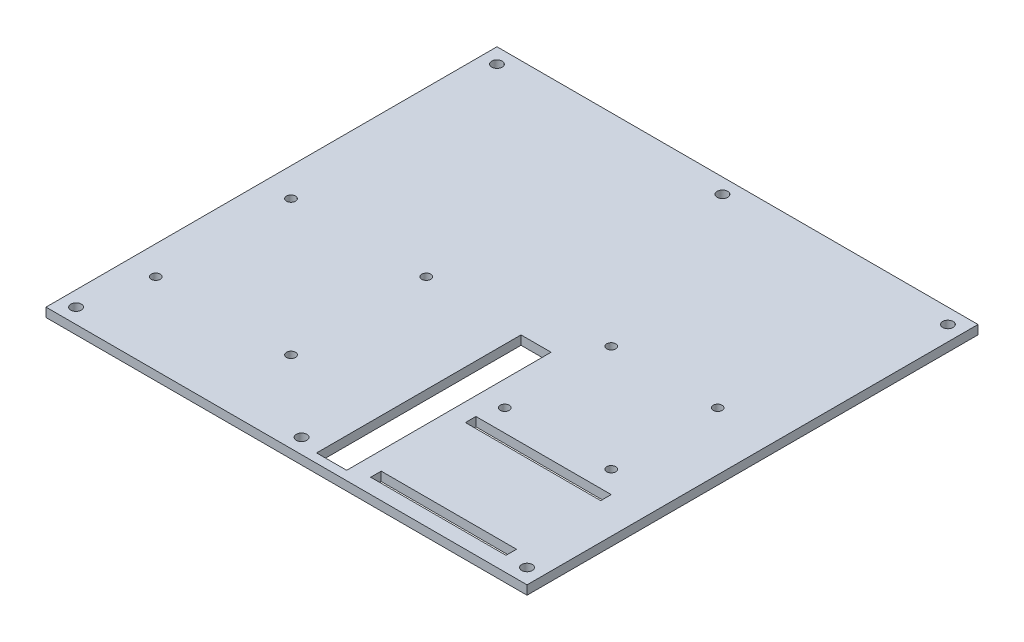
ISO-10303-21;
HEADER;
FILE_DESCRIPTION(('STEP AP214'),'2;1');
FILE_NAME('part.step','',(''),(''),'','','');
FILE_SCHEMA(('AUTOMOTIVE_DESIGN { 1 0 10303 214 1 1 1 1 }'));
ENDSEC;
DATA;
#1=APPLICATION_CONTEXT('core data for automotive mechanical design processes');
#2=APPLICATION_PROTOCOL_DEFINITION('international standard','automotive_design',2000,#1);
#3=PRODUCT_CONTEXT('',#1,'mechanical');
#4=PRODUCT('Part','Part','',(#3));
#5=PRODUCT_RELATED_PRODUCT_CATEGORY('part','',(#4));
#6=PRODUCT_DEFINITION_FORMATION('','',#4);
#7=PRODUCT_DEFINITION_CONTEXT('part definition',#1,'design');
#8=PRODUCT_DEFINITION('design','',#6,#7);
#9=PRODUCT_DEFINITION_SHAPE('','',#8);
#10=(LENGTH_UNIT() NAMED_UNIT(*) SI_UNIT(.MILLI.,.METRE.));
#11=(NAMED_UNIT(*) PLANE_ANGLE_UNIT() SI_UNIT($,.RADIAN.));
#12=(NAMED_UNIT(*) SI_UNIT($,.STERADIAN.) SOLID_ANGLE_UNIT());
#13=UNCERTAINTY_MEASURE_WITH_UNIT(LENGTH_MEASURE(1.E-05),#10,'distance_accuracy_value','');
#14=(GEOMETRIC_REPRESENTATION_CONTEXT(3) GLOBAL_UNCERTAINTY_ASSIGNED_CONTEXT((#13)) GLOBAL_UNIT_ASSIGNED_CONTEXT((#10,
#11,#12)) REPRESENTATION_CONTEXT('',''));
#15=CARTESIAN_POINT('',(0.,0.,0.));
#16=DIRECTION('',(0.,0.,1.));
#17=DIRECTION('',(1.,0.,0.));
#18=AXIS2_PLACEMENT_3D('',#15,#16,#17);
#19=CARTESIAN_POINT('',(0.,3.,0.));
#20=DIRECTION('',(0.,1.,0.));
#21=DIRECTION('',(0.,0.,1.));
#22=AXIS2_PLACEMENT_3D('',#19,#20,#21);
#23=PLANE('',#22);
#24=CARTESIAN_POINT('',(75.,3.,-70.));
#25=DIRECTION('',(0.,1.,0.));
#26=DIRECTION('',(0.,0.,1.));
#27=AXIS2_PLACEMENT_3D('',#24,#25,#26);
#28=CIRCLE('',#27,1.75);
#29=CARTESIAN_POINT('',(75.,3.,-68.25));
#30=VERTEX_POINT('',#29);
#31=EDGE_CURVE('E444',#30,#30,#28,.T.);
#32=ORIENTED_EDGE('',*,*,#31,.F.);
#33=EDGE_LOOP('',(#32));
#34=FACE_BOUND('',#33,.T.);
#35=CARTESIAN_POINT('',(0.,3.,-70.));
#36=DIRECTION('',(0.,1.,0.));
#37=DIRECTION('',(0.,0.,1.));
#38=AXIS2_PLACEMENT_3D('',#35,#36,#37);
#39=CIRCLE('',#38,1.75);
#40=CARTESIAN_POINT('',(0.,3.,-68.25));
#41=VERTEX_POINT('',#40);
#42=EDGE_CURVE('E450',#41,#41,#39,.T.);
#43=ORIENTED_EDGE('',*,*,#42,.F.);
#44=EDGE_LOOP('',(#43));
#45=FACE_BOUND('',#44,.T.);
#46=CARTESIAN_POINT('',(-75.,3.,70.));
#47=DIRECTION('',(0.,1.,0.));
#48=DIRECTION('',(0.,0.,1.));
#49=AXIS2_PLACEMENT_3D('',#46,#47,#48);
#50=CIRCLE('',#49,1.75);
#51=CARTESIAN_POINT('',(-75.,3.,71.75));
#52=VERTEX_POINT('',#51);
#53=EDGE_CURVE('E456',#52,#52,#50,.T.);
#54=ORIENTED_EDGE('',*,*,#53,.F.);
#55=EDGE_LOOP('',(#54));
#56=FACE_BOUND('',#55,.T.);
#57=CARTESIAN_POINT('',(0.,3.,70.));
#58=DIRECTION('',(0.,1.,0.));
#59=DIRECTION('',(0.,0.,1.));
#60=AXIS2_PLACEMENT_3D('',#57,#58,#59);
#61=CIRCLE('',#60,1.75);
#62=CARTESIAN_POINT('',(0.,3.,71.75));
#63=VERTEX_POINT('',#62);
#64=EDGE_CURVE('E437',#63,#63,#61,.T.);
#65=ORIENTED_EDGE('',*,*,#64,.F.);
#66=EDGE_LOOP('',(#65));
#67=FACE_BOUND('',#66,.T.);
#68=CARTESIAN_POINT('',(75.,3.,70.));
#69=DIRECTION('',(0.,1.,0.));
#70=DIRECTION('',(0.,0.,1.));
#71=AXIS2_PLACEMENT_3D('',#68,#69,#70);
#72=CIRCLE('',#71,1.75);
#73=CARTESIAN_POINT('',(75.,3.,71.75));
#74=VERTEX_POINT('',#73);
#75=EDGE_CURVE('E434',#74,#74,#72,.T.);
#76=ORIENTED_EDGE('',*,*,#75,.F.);
#77=EDGE_LOOP('',(#76));
#78=FACE_BOUND('',#77,.T.);
#79=CARTESIAN_POINT('',(-75.,3.,-70.));
#80=DIRECTION('',(0.,1.,0.));
#81=DIRECTION('',(0.,0.,1.));
#82=AXIS2_PLACEMENT_3D('',#79,#80,#81);
#83=CIRCLE('',#82,1.75);
#84=CARTESIAN_POINT('',(-75.,3.,-68.25));
#85=VERTEX_POINT('',#84);
#86=EDGE_CURVE('E443',#85,#85,#83,.T.);
#87=ORIENTED_EDGE('',*,*,#86,.F.);
#88=EDGE_LOOP('',(#87));
#89=FACE_BOUND('',#88,.T.);
#90=CARTESIAN_POINT('',(60.7,3.,-7.70000000000003));
#91=DIRECTION('',(0.,1.,0.));
#92=DIRECTION('',(0.,0.,1.));
#93=AXIS2_PLACEMENT_3D('',#90,#91,#92);
#94=CIRCLE('',#93,1.5);
#95=CARTESIAN_POINT('',(60.7,3.,-6.20000000000002));
#96=VERTEX_POINT('',#95);
#97=EDGE_CURVE('E467',#96,#96,#94,.T.);
#98=ORIENTED_EDGE('',*,*,#97,.F.);
#99=EDGE_LOOP('',(#98));
#100=FACE_BOUND('',#99,.T.);
#101=CARTESIAN_POINT('',(25.3,3.,-7.70000000000003));
#102=DIRECTION('',(0.,1.,0.));
#103=DIRECTION('',(0.,0.,1.));
#104=AXIS2_PLACEMENT_3D('',#101,#102,#103);
#105=CIRCLE('',#104,1.5);
#106=CARTESIAN_POINT('',(25.3,3.,-6.20000000000003));
#107=VERTEX_POINT('',#106);
#108=EDGE_CURVE('E480',#107,#107,#105,.T.);
#109=ORIENTED_EDGE('',*,*,#108,.F.);
#110=EDGE_LOOP('',(#109));
#111=FACE_BOUND('',#110,.T.);
#112=CARTESIAN_POINT('',(25.3,3.,27.7));
#113=DIRECTION('',(0.,1.,0.));
#114=DIRECTION('',(0.,0.,1.));
#115=AXIS2_PLACEMENT_3D('',#112,#113,#114);
#116=CIRCLE('',#115,1.5);
#117=CARTESIAN_POINT('',(25.3,3.,29.2));
#118=VERTEX_POINT('',#117);
#119=EDGE_CURVE('E474',#118,#118,#116,.T.);
#120=ORIENTED_EDGE('',*,*,#119,.F.);
#121=EDGE_LOOP('',(#120));
#122=FACE_BOUND('',#121,.T.);
#123=CARTESIAN_POINT('',(60.7,3.,27.7));
#124=DIRECTION('',(0.,1.,0.));
#125=DIRECTION('',(0.,0.,1.));
#126=AXIS2_PLACEMENT_3D('',#123,#124,#125);
#127=CIRCLE('',#126,1.5);
#128=CARTESIAN_POINT('',(60.7,3.,29.2));
#129=VERTEX_POINT('',#128);
#130=EDGE_CURVE('E473',#129,#129,#127,.T.);
#131=ORIENTED_EDGE('',*,*,#130,.F.);
#132=EDGE_LOOP('',(#131));
#133=FACE_BOUND('',#132,.T.);
#134=CARTESIAN_POINT('',(-25.5,3.,3.00000000000003));
#135=DIRECTION('',(0.,1.,0.));
#136=DIRECTION('',(0.,0.,-1.));
#137=AXIS2_PLACEMENT_3D('',#134,#135,#136);
#138=CIRCLE('',#137,1.5);
#139=CARTESIAN_POINT('',(-25.5,3.,1.50000000000002));
#140=VERTEX_POINT('',#139);
#141=EDGE_CURVE('E491',#140,#140,#138,.T.);
#142=ORIENTED_EDGE('',*,*,#141,.F.);
#143=EDGE_LOOP('',(#142));
#144=FACE_BOUND('',#143,.T.);
#145=CARTESIAN_POINT('',(-25.5,3.,48.));
#146=DIRECTION('',(0.,1.,0.));
#147=DIRECTION('',(0.,0.,-1.));
#148=AXIS2_PLACEMENT_3D('',#145,#146,#147);
#149=CIRCLE('',#148,1.5);
#150=CARTESIAN_POINT('',(-25.5,3.,46.5));
#151=VERTEX_POINT('',#150);
#152=EDGE_CURVE('E503',#151,#151,#149,.T.);
#153=ORIENTED_EDGE('',*,*,#152,.F.);
#154=EDGE_LOOP('',(#153));
#155=FACE_BOUND('',#154,.T.);
#156=CARTESIAN_POINT('',(-70.5,3.,48.));
#157=DIRECTION('',(0.,1.,0.));
#158=DIRECTION('',(0.,0.,1.));
#159=AXIS2_PLACEMENT_3D('',#156,#157,#158);
#160=CIRCLE('',#159,1.5);
#161=CARTESIAN_POINT('',(-70.5,3.,49.5));
#162=VERTEX_POINT('',#161);
#163=EDGE_CURVE('E497',#162,#162,#160,.T.);
#164=ORIENTED_EDGE('',*,*,#163,.F.);
#165=EDGE_LOOP('',(#164));
#166=FACE_BOUND('',#165,.T.);
#167=CARTESIAN_POINT('',(-70.5,3.,3.00000000000003));
#168=DIRECTION('',(0.,1.,0.));
#169=DIRECTION('',(0.,0.,1.));
#170=AXIS2_PLACEMENT_3D('',#167,#168,#169);
#171=CIRCLE('',#170,1.5);
#172=CARTESIAN_POINT('',(-70.5,3.,4.50000000000003));
#173=VERTEX_POINT('',#172);
#174=EDGE_CURVE('E167',#173,#173,#171,.T.);
#175=ORIENTED_EDGE('',*,*,#174,.F.);
#176=EDGE_LOOP('',(#175));
#177=FACE_BOUND('',#176,.T.);
#178=DIRECTION('',(0.,0.,1.));
#179=VECTOR('',#178,1.);
#180=CARTESIAN_POINT('',(23.,3.,70.));
#181=LINE('',#180,#179);
#182=CARTESIAN_POINT('',(23.,3.,66.5));
#183=VERTEX_POINT('',#182);
#184=CARTESIAN_POINT('',(23.,3.,70.));
#185=VERTEX_POINT('',#184);
#186=EDGE_CURVE('E180',#183,#185,#181,.T.);
#187=ORIENTED_EDGE('',*,*,#186,.F.);
#188=DIRECTION('',(-1.,0.,0.));
#189=VECTOR('',#188,1.);
#190=CARTESIAN_POINT('',(68.,3.,66.5));
#191=LINE('',#190,#189);
#192=CARTESIAN_POINT('',(68.,3.,66.5));
#193=VERTEX_POINT('',#192);
#194=EDGE_CURVE('E188',#193,#183,#191,.T.);
#195=ORIENTED_EDGE('',*,*,#194,.F.);
#196=DIRECTION('',(0.,0.,-1.));
#197=VECTOR('',#196,1.);
#198=CARTESIAN_POINT('',(68.,3.,70.));
#199=LINE('',#198,#197);
#200=CARTESIAN_POINT('',(68.,3.,70.));
#201=VERTEX_POINT('',#200);
#202=EDGE_CURVE('E202',#201,#193,#199,.T.);
#203=ORIENTED_EDGE('',*,*,#202,.F.);
#204=DIRECTION('',(1.,0.,0.));
#205=VECTOR('',#204,1.);
#206=CARTESIAN_POINT('',(68.,3.,70.));
#207=LINE('',#206,#205);
#208=EDGE_CURVE('E199',#185,#201,#207,.T.);
#209=ORIENTED_EDGE('',*,*,#208,.F.);
#210=EDGE_LOOP('',(#187,#195,#203,#209));
#211=FACE_BOUND('',#210,.T.);
#212=DIRECTION('',(0.,0.,1.));
#213=VECTOR('',#212,1.);
#214=CARTESIAN_POINT('',(-80.,3.,75.));
#215=LINE('',#214,#213);
#216=CARTESIAN_POINT('',(-80.,3.,-75.));
#217=VERTEX_POINT('',#216);
#218=CARTESIAN_POINT('',(-80.,3.,75.));
#219=VERTEX_POINT('',#218);
#220=EDGE_CURVE('E247',#217,#219,#215,.T.);
#221=ORIENTED_EDGE('',*,*,#220,.T.);
#222=DIRECTION('',(1.,0.,0.));
#223=VECTOR('',#222,1.);
#224=CARTESIAN_POINT('',(80.,3.,75.));
#225=LINE('',#224,#223);
#226=CARTESIAN_POINT('',(80.,3.,75.));
#227=VERTEX_POINT('',#226);
#228=EDGE_CURVE('E250',#219,#227,#225,.T.);
#229=ORIENTED_EDGE('',*,*,#228,.T.);
#230=DIRECTION('',(0.,0.,-1.));
#231=VECTOR('',#230,1.);
#232=CARTESIAN_POINT('',(80.,3.,75.));
#233=LINE('',#232,#231);
#234=CARTESIAN_POINT('',(80.,3.,-75.));
#235=VERTEX_POINT('',#234);
#236=EDGE_CURVE('E253',#227,#235,#233,.T.);
#237=ORIENTED_EDGE('',*,*,#236,.T.);
#238=DIRECTION('',(-1.,0.,0.));
#239=VECTOR('',#238,1.);
#240=CARTESIAN_POINT('',(80.,3.,-75.));
#241=LINE('',#240,#239);
#242=EDGE_CURVE('E255',#235,#217,#241,.T.);
#243=ORIENTED_EDGE('',*,*,#242,.T.);
#244=EDGE_LOOP('',(#221,#229,#237,#243));
#245=FACE_BOUND('',#244,.T.);
#246=DIRECTION('',(1.,0.,0.));
#247=VECTOR('',#246,1.);
#248=CARTESIAN_POINT('',(7.,3.,4.00000000000002));
#249=LINE('',#248,#247);
#250=CARTESIAN_POINT('',(7.,3.,4.00000000000002));
#251=VERTEX_POINT('',#250);
#252=CARTESIAN_POINT('',(17.,3.,4.00000000000002));
#253=VERTEX_POINT('',#252);
#254=EDGE_CURVE('E229',#251,#253,#249,.T.);
#255=ORIENTED_EDGE('',*,*,#254,.T.);
#256=DIRECTION('',(0.,0.,1.));
#257=VECTOR('',#256,1.);
#258=CARTESIAN_POINT('',(17.,3.,72.));
#259=LINE('',#258,#257);
#260=CARTESIAN_POINT('',(17.,3.,72.));
#261=VERTEX_POINT('',#260);
#262=EDGE_CURVE('E209',#253,#261,#259,.T.);
#263=ORIENTED_EDGE('',*,*,#262,.T.);
#264=DIRECTION('',(-1.,0.,0.));
#265=VECTOR('',#264,1.);
#266=CARTESIAN_POINT('',(7.,3.,72.));
#267=LINE('',#266,#265);
#268=CARTESIAN_POINT('',(7.,3.,72.));
#269=VERTEX_POINT('',#268);
#270=EDGE_CURVE('E219',#261,#269,#267,.T.);
#271=ORIENTED_EDGE('',*,*,#270,.T.);
#272=DIRECTION('',(0.,0.,-1.));
#273=VECTOR('',#272,1.);
#274=CARTESIAN_POINT('',(7.,3.,72.));
#275=LINE('',#274,#273);
#276=EDGE_CURVE('E232',#269,#251,#275,.T.);
#277=ORIENTED_EDGE('',*,*,#276,.T.);
#278=EDGE_LOOP('',(#255,#263,#271,#277));
#279=FACE_BOUND('',#278,.T.);
#280=DIRECTION('',(-1.,0.,0.));
#281=VECTOR('',#280,1.);
#282=CARTESIAN_POINT('',(68.,3.,38.5));
#283=LINE('',#282,#281);
#284=CARTESIAN_POINT('',(68.,3.,38.5));
#285=VERTEX_POINT('',#284);
#286=CARTESIAN_POINT('',(23.,3.,38.5));
#287=VERTEX_POINT('',#286);
#288=EDGE_CURVE('E173',#285,#287,#283,.T.);
#289=ORIENTED_EDGE('',*,*,#288,.T.);
#290=DIRECTION('',(0.,0.,-1.));
#291=VECTOR('',#290,1.);
#292=CARTESIAN_POINT('',(23.,3.,35.));
#293=LINE('',#292,#291);
#294=CARTESIAN_POINT('',(23.,3.,35.));
#295=VERTEX_POINT('',#294);
#296=EDGE_CURVE('E47',#287,#295,#293,.T.);
#297=ORIENTED_EDGE('',*,*,#296,.T.);
#298=DIRECTION('',(1.,0.,0.));
#299=VECTOR('',#298,1.);
#300=CARTESIAN_POINT('',(68.,3.,35.));
#301=LINE('',#300,#299);
#302=CARTESIAN_POINT('',(68.,3.,35.));
#303=VERTEX_POINT('',#302);
#304=EDGE_CURVE('E161',#295,#303,#301,.T.);
#305=ORIENTED_EDGE('',*,*,#304,.T.);
#306=DIRECTION('',(0.,0.,1.));
#307=VECTOR('',#306,1.);
#308=CARTESIAN_POINT('',(68.,3.,35.));
#309=LINE('',#308,#307);
#310=EDGE_CURVE('E164',#303,#285,#309,.T.);
#311=ORIENTED_EDGE('',*,*,#310,.T.);
#312=EDGE_LOOP('',(#289,#297,#305,#311));
#313=FACE_BOUND('',#312,.T.);
#314=ADVANCED_FACE('F32',(#34,#45,#56,#67,#78,#89,#100,#111,#122,#133,#144,#155,#166,#177,#211,
#245,#279,#313),#23,.T.);
#315=CARTESIAN_POINT('',(0.,0.,0.));
#316=DIRECTION('',(0.,1.,0.));
#317=DIRECTION('',(0.,0.,1.));
#318=AXIS2_PLACEMENT_3D('',#315,#316,#317);
#319=PLANE('',#318);
#320=CARTESIAN_POINT('',(75.,0.,-70.));
#321=DIRECTION('',(0.,1.,0.));
#322=DIRECTION('',(0.,0.,1.));
#323=AXIS2_PLACEMENT_3D('',#320,#321,#322);
#324=CIRCLE('',#323,1.75);
#325=CARTESIAN_POINT('',(75.,0.,-68.25));
#326=VERTEX_POINT('',#325);
#327=EDGE_CURVE('E440',#326,#326,#324,.T.);
#328=ORIENTED_EDGE('',*,*,#327,.T.);
#329=EDGE_LOOP('',(#328));
#330=FACE_BOUND('',#329,.T.);
#331=CARTESIAN_POINT('',(0.,0.,-70.));
#332=DIRECTION('',(0.,1.,0.));
#333=DIRECTION('',(0.,0.,1.));
#334=AXIS2_PLACEMENT_3D('',#331,#332,#333);
#335=CIRCLE('',#334,1.75);
#336=CARTESIAN_POINT('',(0.,0.,-68.25));
#337=VERTEX_POINT('',#336);
#338=EDGE_CURVE('E447',#337,#337,#335,.T.);
#339=ORIENTED_EDGE('',*,*,#338,.T.);
#340=EDGE_LOOP('',(#339));
#341=FACE_BOUND('',#340,.T.);
#342=CARTESIAN_POINT('',(-75.,0.,70.));
#343=DIRECTION('',(0.,1.,0.));
#344=DIRECTION('',(0.,0.,1.));
#345=AXIS2_PLACEMENT_3D('',#342,#343,#344);
#346=CIRCLE('',#345,1.75);
#347=CARTESIAN_POINT('',(-75.,0.,71.75));
#348=VERTEX_POINT('',#347);
#349=EDGE_CURVE('E453',#348,#348,#346,.T.);
#350=ORIENTED_EDGE('',*,*,#349,.T.);
#351=EDGE_LOOP('',(#350));
#352=FACE_BOUND('',#351,.T.);
#353=CARTESIAN_POINT('',(0.,0.,70.));
#354=DIRECTION('',(0.,1.,0.));
#355=DIRECTION('',(0.,0.,1.));
#356=AXIS2_PLACEMENT_3D('',#353,#354,#355);
#357=CIRCLE('',#356,1.75);
#358=CARTESIAN_POINT('',(0.,0.,71.75));
#359=VERTEX_POINT('',#358);
#360=EDGE_CURVE('E459',#359,#359,#357,.T.);
#361=ORIENTED_EDGE('',*,*,#360,.T.);
#362=EDGE_LOOP('',(#361));
#363=FACE_BOUND('',#362,.T.);
#364=CARTESIAN_POINT('',(75.,0.,70.));
#365=DIRECTION('',(0.,1.,0.));
#366=DIRECTION('',(0.,0.,1.));
#367=AXIS2_PLACEMENT_3D('',#364,#365,#366);
#368=CIRCLE('',#367,1.75);
#369=CARTESIAN_POINT('',(75.,0.,71.75));
#370=VERTEX_POINT('',#369);
#371=EDGE_CURVE('E431',#370,#370,#368,.T.);
#372=ORIENTED_EDGE('',*,*,#371,.T.);
#373=EDGE_LOOP('',(#372));
#374=FACE_BOUND('',#373,.T.);
#375=CARTESIAN_POINT('',(-75.,0.,-70.));
#376=DIRECTION('',(0.,1.,0.));
#377=DIRECTION('',(0.,0.,1.));
#378=AXIS2_PLACEMENT_3D('',#375,#376,#377);
#379=CIRCLE('',#378,1.75);
#380=CARTESIAN_POINT('',(-75.,0.,-68.25));
#381=VERTEX_POINT('',#380);
#382=EDGE_CURVE('E464',#381,#381,#379,.T.);
#383=ORIENTED_EDGE('',*,*,#382,.T.);
#384=EDGE_LOOP('',(#383));
#385=FACE_BOUND('',#384,.T.);
#386=CARTESIAN_POINT('',(60.7,0.,-7.70000000000003));
#387=DIRECTION('',(0.,1.,0.));
#388=DIRECTION('',(0.,0.,1.));
#389=AXIS2_PLACEMENT_3D('',#386,#387,#388);
#390=CIRCLE('',#389,1.5);
#391=CARTESIAN_POINT('',(60.7,0.,-6.20000000000002));
#392=VERTEX_POINT('',#391);
#393=EDGE_CURVE('E483',#392,#392,#390,.T.);
#394=ORIENTED_EDGE('',*,*,#393,.T.);
#395=EDGE_LOOP('',(#394));
#396=FACE_BOUND('',#395,.T.);
#397=CARTESIAN_POINT('',(25.3,0.,-7.70000000000003));
#398=DIRECTION('',(0.,1.,0.));
#399=DIRECTION('',(0.,0.,1.));
#400=AXIS2_PLACEMENT_3D('',#397,#398,#399);
#401=CIRCLE('',#400,1.5);
#402=CARTESIAN_POINT('',(25.3,0.,-6.20000000000003));
#403=VERTEX_POINT('',#402);
#404=EDGE_CURVE('E477',#403,#403,#401,.T.);
#405=ORIENTED_EDGE('',*,*,#404,.T.);
#406=EDGE_LOOP('',(#405));
#407=FACE_BOUND('',#406,.T.);
#408=CARTESIAN_POINT('',(25.3,0.,27.7));
#409=DIRECTION('',(0.,1.,0.));
#410=DIRECTION('',(0.,0.,1.));
#411=AXIS2_PLACEMENT_3D('',#408,#409,#410);
#412=CIRCLE('',#411,1.5);
#413=CARTESIAN_POINT('',(25.3,0.,29.2));
#414=VERTEX_POINT('',#413);
#415=EDGE_CURVE('E470',#414,#414,#412,.T.);
#416=ORIENTED_EDGE('',*,*,#415,.T.);
#417=EDGE_LOOP('',(#416));
#418=FACE_BOUND('',#417,.T.);
#419=CARTESIAN_POINT('',(60.7,0.,27.7));
#420=DIRECTION('',(0.,1.,0.));
#421=DIRECTION('',(0.,0.,1.));
#422=AXIS2_PLACEMENT_3D('',#419,#420,#421);
#423=CIRCLE('',#422,1.5);
#424=CARTESIAN_POINT('',(60.7,0.,29.2));
#425=VERTEX_POINT('',#424);
#426=EDGE_CURVE('E488',#425,#425,#423,.T.);
#427=ORIENTED_EDGE('',*,*,#426,.T.);
#428=EDGE_LOOP('',(#427));
#429=FACE_BOUND('',#428,.T.);
#430=CARTESIAN_POINT('',(-25.5,0.,3.00000000000003));
#431=DIRECTION('',(0.,1.,0.));
#432=DIRECTION('',(0.,0.,-1.));
#433=AXIS2_PLACEMENT_3D('',#430,#431,#432);
#434=CIRCLE('',#433,1.5);
#435=CARTESIAN_POINT('',(-25.5,0.,1.50000000000002));
#436=VERTEX_POINT('',#435);
#437=EDGE_CURVE('E506',#436,#436,#434,.T.);
#438=ORIENTED_EDGE('',*,*,#437,.T.);
#439=EDGE_LOOP('',(#438));
#440=FACE_BOUND('',#439,.T.);
#441=CARTESIAN_POINT('',(-25.5,0.,48.));
#442=DIRECTION('',(0.,1.,0.));
#443=DIRECTION('',(0.,0.,-1.));
#444=AXIS2_PLACEMENT_3D('',#441,#442,#443);
#445=CIRCLE('',#444,1.5);
#446=CARTESIAN_POINT('',(-25.5,0.,46.5));
#447=VERTEX_POINT('',#446);
#448=EDGE_CURVE('E500',#447,#447,#445,.T.);
#449=ORIENTED_EDGE('',*,*,#448,.T.);
#450=EDGE_LOOP('',(#449));
#451=FACE_BOUND('',#450,.T.);
#452=CARTESIAN_POINT('',(-70.5,0.,48.));
#453=DIRECTION('',(0.,1.,0.));
#454=DIRECTION('',(0.,0.,1.));
#455=AXIS2_PLACEMENT_3D('',#452,#453,#454);
#456=CIRCLE('',#455,1.5);
#457=CARTESIAN_POINT('',(-70.5,0.,49.5));
#458=VERTEX_POINT('',#457);
#459=EDGE_CURVE('E494',#458,#458,#456,.T.);
#460=ORIENTED_EDGE('',*,*,#459,.T.);
#461=EDGE_LOOP('',(#460));
#462=FACE_BOUND('',#461,.T.);
#463=CARTESIAN_POINT('',(-70.5,0.,3.00000000000003));
#464=DIRECTION('',(0.,1.,0.));
#465=DIRECTION('',(0.,0.,1.));
#466=AXIS2_PLACEMENT_3D('',#463,#464,#465);
#467=CIRCLE('',#466,1.5);
#468=CARTESIAN_POINT('',(-70.5,0.,4.50000000000003));
#469=VERTEX_POINT('',#468);
#470=EDGE_CURVE('E174',#469,#469,#467,.T.);
#471=ORIENTED_EDGE('',*,*,#470,.T.);
#472=EDGE_LOOP('',(#471));
#473=FACE_BOUND('',#472,.T.);
#474=DIRECTION('',(0.,0.,1.));
#475=VECTOR('',#474,1.);
#476=CARTESIAN_POINT('',(17.,0.,72.));
#477=LINE('',#476,#475);
#478=CARTESIAN_POINT('',(17.,0.,4.00000000000002));
#479=VERTEX_POINT('',#478);
#480=CARTESIAN_POINT('',(17.,0.,72.));
#481=VERTEX_POINT('',#480);
#482=EDGE_CURVE('E216',#479,#481,#477,.T.);
#483=ORIENTED_EDGE('',*,*,#482,.F.);
#484=DIRECTION('',(1.,0.,0.));
#485=VECTOR('',#484,1.);
#486=CARTESIAN_POINT('',(7.,0.,4.00000000000002));
#487=LINE('',#486,#485);
#488=CARTESIAN_POINT('',(7.,0.,4.00000000000002));
#489=VERTEX_POINT('',#488);
#490=EDGE_CURVE('E218',#489,#479,#487,.T.);
#491=ORIENTED_EDGE('',*,*,#490,.F.);
#492=DIRECTION('',(0.,0.,-1.));
#493=VECTOR('',#492,1.);
#494=CARTESIAN_POINT('',(7.,0.,72.));
#495=LINE('',#494,#493);
#496=CARTESIAN_POINT('',(7.,0.,72.));
#497=VERTEX_POINT('',#496);
#498=EDGE_CURVE('E221',#497,#489,#495,.T.);
#499=ORIENTED_EDGE('',*,*,#498,.F.);
#500=DIRECTION('',(-1.,0.,0.));
#501=VECTOR('',#500,1.);
#502=CARTESIAN_POINT('',(7.,0.,72.));
#503=LINE('',#502,#501);
#504=EDGE_CURVE('E224',#481,#497,#503,.T.);
#505=ORIENTED_EDGE('',*,*,#504,.F.);
#506=EDGE_LOOP('',(#483,#491,#499,#505));
#507=FACE_BOUND('',#506,.T.);
#508=DIRECTION('',(0.,0.,1.));
#509=VECTOR('',#508,1.);
#510=CARTESIAN_POINT('',(-80.,0.,75.));
#511=LINE('',#510,#509);
#512=CARTESIAN_POINT('',(-80.,0.,-75.));
#513=VERTEX_POINT('',#512);
#514=CARTESIAN_POINT('',(-80.,0.,75.));
#515=VERTEX_POINT('',#514);
#516=EDGE_CURVE('E240',#513,#515,#511,.T.);
#517=ORIENTED_EDGE('',*,*,#516,.F.);
#518=DIRECTION('',(-1.,0.,0.));
#519=VECTOR('',#518,1.);
#520=CARTESIAN_POINT('',(80.,0.,-75.));
#521=LINE('',#520,#519);
#522=CARTESIAN_POINT('',(80.,0.,-75.));
#523=VERTEX_POINT('',#522);
#524=EDGE_CURVE('E251',#523,#513,#521,.T.);
#525=ORIENTED_EDGE('',*,*,#524,.F.);
#526=DIRECTION('',(0.,0.,-1.));
#527=VECTOR('',#526,1.);
#528=CARTESIAN_POINT('',(80.,0.,75.));
#529=LINE('',#528,#527);
#530=CARTESIAN_POINT('',(80.,0.,75.));
#531=VERTEX_POINT('',#530);
#532=EDGE_CURVE('E262',#531,#523,#529,.T.);
#533=ORIENTED_EDGE('',*,*,#532,.F.);
#534=DIRECTION('',(1.,0.,0.));
#535=VECTOR('',#534,1.);
#536=CARTESIAN_POINT('',(80.,0.,75.));
#537=LINE('',#536,#535);
#538=EDGE_CURVE('E260',#515,#531,#537,.T.);
#539=ORIENTED_EDGE('',*,*,#538,.F.);
#540=EDGE_LOOP('',(#517,#525,#533,#539));
#541=FACE_BOUND('',#540,.T.);
#542=DIRECTION('',(-1.,0.,0.));
#543=VECTOR('',#542,1.);
#544=CARTESIAN_POINT('',(68.,0.,66.5));
#545=LINE('',#544,#543);
#546=CARTESIAN_POINT('',(68.,0.,66.5));
#547=VERTEX_POINT('',#546);
#548=CARTESIAN_POINT('',(23.,0.,66.5));
#549=VERTEX_POINT('',#548);
#550=EDGE_CURVE('E194',#547,#549,#545,.T.);
#551=ORIENTED_EDGE('',*,*,#550,.T.);
#552=DIRECTION('',(0.,0.,1.));
#553=VECTOR('',#552,1.);
#554=CARTESIAN_POINT('',(23.,0.,70.));
#555=LINE('',#554,#553);
#556=CARTESIAN_POINT('',(23.,0.,70.));
#557=VERTEX_POINT('',#556);
#558=EDGE_CURVE('E184',#549,#557,#555,.T.);
#559=ORIENTED_EDGE('',*,*,#558,.T.);
#560=DIRECTION('',(1.,0.,0.));
#561=VECTOR('',#560,1.);
#562=CARTESIAN_POINT('',(68.,0.,70.));
#563=LINE('',#562,#561);
#564=CARTESIAN_POINT('',(68.,0.,70.));
#565=VERTEX_POINT('',#564);
#566=EDGE_CURVE('E187',#557,#565,#563,.T.);
#567=ORIENTED_EDGE('',*,*,#566,.T.);
#568=DIRECTION('',(0.,0.,-1.));
#569=VECTOR('',#568,1.);
#570=CARTESIAN_POINT('',(68.,0.,70.));
#571=LINE('',#570,#569);
#572=EDGE_CURVE('E191',#565,#547,#571,.T.);
#573=ORIENTED_EDGE('',*,*,#572,.T.);
#574=EDGE_LOOP('',(#551,#559,#567,#573));
#575=FACE_BOUND('',#574,.T.);
#576=DIRECTION('',(0.,0.,-1.));
#577=VECTOR('',#576,1.);
#578=CARTESIAN_POINT('',(23.,0.,35.));
#579=LINE('',#578,#577);
#580=CARTESIAN_POINT('',(23.,0.,38.5));
#581=VERTEX_POINT('',#580);
#582=CARTESIAN_POINT('',(23.,0.,35.));
#583=VERTEX_POINT('',#582);
#584=EDGE_CURVE('E153',#581,#583,#579,.T.);
#585=ORIENTED_EDGE('',*,*,#584,.F.);
#586=DIRECTION('',(-1.,0.,0.));
#587=VECTOR('',#586,1.);
#588=CARTESIAN_POINT('',(68.,0.,38.5));
#589=LINE('',#588,#587);
#590=CARTESIAN_POINT('',(68.,0.,38.5));
#591=VERTEX_POINT('',#590);
#592=EDGE_CURVE('E145',#591,#581,#589,.T.);
#593=ORIENTED_EDGE('',*,*,#592,.F.);
#594=DIRECTION('',(0.,0.,1.));
#595=VECTOR('',#594,1.);
#596=CARTESIAN_POINT('',(68.,0.,35.));
#597=LINE('',#596,#595);
#598=CARTESIAN_POINT('',(68.,0.,35.));
#599=VERTEX_POINT('',#598);
#600=EDGE_CURVE('E152',#599,#591,#597,.T.);
#601=ORIENTED_EDGE('',*,*,#600,.F.);
#602=DIRECTION('',(1.,0.,0.));
#603=VECTOR('',#602,1.);
#604=CARTESIAN_POINT('',(68.,0.,35.));
#605=LINE('',#604,#603);
#606=EDGE_CURVE('E157',#583,#599,#605,.T.);
#607=ORIENTED_EDGE('',*,*,#606,.F.);
#608=EDGE_LOOP('',(#585,#593,#601,#607));
#609=FACE_BOUND('',#608,.T.);
#610=ADVANCED_FACE('F160',(#330,#341,#352,#363,#374,#385,#396,#407,#418,#429,#440,#451,#462,
#473,#507,#541,#575,#609),#319,.F.);
#611=CARTESIAN_POINT('',(-80.,3.,75.));
#612=DIRECTION('',(1.,0.,0.));
#613=DIRECTION('',(0.,0.,-1.));
#614=AXIS2_PLACEMENT_3D('',#611,#612,#613);
#615=PLANE('',#614);
#616=ORIENTED_EDGE('',*,*,#516,.T.);
#617=DIRECTION('',(0.,-1.,0.));
#618=VECTOR('',#617,1.);
#619=CARTESIAN_POINT('',(-80.,3.,75.));
#620=LINE('',#619,#618);
#621=EDGE_CURVE('E11',#219,#515,#620,.T.);
#622=ORIENTED_EDGE('',*,*,#621,.F.);
#623=ORIENTED_EDGE('',*,*,#220,.F.);
#624=DIRECTION('',(0.,-1.,0.));
#625=VECTOR('',#624,1.);
#626=CARTESIAN_POINT('',(-80.,3.,-75.));
#627=LINE('',#626,#625);
#628=EDGE_CURVE('E257',#217,#513,#627,.T.);
#629=ORIENTED_EDGE('',*,*,#628,.T.);
#630=EDGE_LOOP('',(#616,#622,#623,#629));
#631=FACE_BOUND('',#630,.T.);
#632=ADVANCED_FACE('F34',(#631),#615,.F.);
#633=CARTESIAN_POINT('',(80.,3.,75.));
#634=DIRECTION('',(0.,0.,-1.));
#635=DIRECTION('',(-1.,0.,0.));
#636=AXIS2_PLACEMENT_3D('',#633,#634,#635);
#637=PLANE('',#636);
#638=ORIENTED_EDGE('',*,*,#538,.T.);
#639=DIRECTION('',(0.,-1.,0.));
#640=VECTOR('',#639,1.);
#641=CARTESIAN_POINT('',(80.,3.,75.));
#642=LINE('',#641,#640);
#643=EDGE_CURVE('E40',#227,#531,#642,.T.);
#644=ORIENTED_EDGE('',*,*,#643,.F.);
#645=ORIENTED_EDGE('',*,*,#228,.F.);
#646=ORIENTED_EDGE('',*,*,#621,.T.);
#647=EDGE_LOOP('',(#638,#644,#645,#646));
#648=FACE_BOUND('',#647,.T.);
#649=ADVANCED_FACE('F290',(#648),#637,.F.);
#650=CARTESIAN_POINT('',(80.,3.,75.));
#651=DIRECTION('',(-1.,0.,0.));
#652=DIRECTION('',(0.,0.,1.));
#653=AXIS2_PLACEMENT_3D('',#650,#651,#652);
#654=PLANE('',#653);
#655=ORIENTED_EDGE('',*,*,#532,.T.);
#656=DIRECTION('',(0.,-1.,0.));
#657=VECTOR('',#656,1.);
#658=CARTESIAN_POINT('',(80.,3.,-75.));
#659=LINE('',#658,#657);
#660=EDGE_CURVE('E267',#235,#523,#659,.T.);
#661=ORIENTED_EDGE('',*,*,#660,.F.);
#662=ORIENTED_EDGE('',*,*,#236,.F.);
#663=ORIENTED_EDGE('',*,*,#643,.T.);
#664=EDGE_LOOP('',(#655,#661,#662,#663));
#665=FACE_BOUND('',#664,.T.);
#666=ADVANCED_FACE('F274',(#665),#654,.F.);
#667=CARTESIAN_POINT('',(80.,3.,-75.));
#668=DIRECTION('',(0.,0.,1.));
#669=DIRECTION('',(1.,0.,0.));
#670=AXIS2_PLACEMENT_3D('',#667,#668,#669);
#671=PLANE('',#670);
#672=ORIENTED_EDGE('',*,*,#524,.T.);
#673=ORIENTED_EDGE('',*,*,#628,.F.);
#674=ORIENTED_EDGE('',*,*,#242,.F.);
#675=ORIENTED_EDGE('',*,*,#660,.T.);
#676=EDGE_LOOP('',(#672,#673,#674,#675));
#677=FACE_BOUND('',#676,.T.);
#678=ADVANCED_FACE('F283',(#677),#671,.F.);
#679=CARTESIAN_POINT('',(17.,0.,72.));
#680=DIRECTION('',(-1.,0.,0.));
#681=DIRECTION('',(0.,0.,1.));
#682=AXIS2_PLACEMENT_3D('',#679,#680,#681);
#683=PLANE('',#682);
#684=ORIENTED_EDGE('',*,*,#262,.F.);
#685=DIRECTION('',(0.,1.,0.));
#686=VECTOR('',#685,1.);
#687=CARTESIAN_POINT('',(17.,0.,4.00000000000002));
#688=LINE('',#687,#686);
#689=EDGE_CURVE('E226',#479,#253,#688,.T.);
#690=ORIENTED_EDGE('',*,*,#689,.F.);
#691=ORIENTED_EDGE('',*,*,#482,.T.);
#692=DIRECTION('',(0.,1.,0.));
#693=VECTOR('',#692,1.);
#694=CARTESIAN_POINT('',(17.,0.,72.));
#695=LINE('',#694,#693);
#696=EDGE_CURVE('E237',#481,#261,#695,.T.);
#697=ORIENTED_EDGE('',*,*,#696,.T.);
#698=EDGE_LOOP('',(#684,#690,#691,#697));
#699=FACE_BOUND('',#698,.T.);
#700=ADVANCED_FACE('F308',(#699),#683,.T.);
#701=CARTESIAN_POINT('',(7.,0.,72.));
#702=DIRECTION('',(0.,0.,-1.));
#703=DIRECTION('',(-1.,0.,0.));
#704=AXIS2_PLACEMENT_3D('',#701,#702,#703);
#705=PLANE('',#704);
#706=ORIENTED_EDGE('',*,*,#270,.F.);
#707=ORIENTED_EDGE('',*,*,#696,.F.);
#708=ORIENTED_EDGE('',*,*,#504,.T.);
#709=DIRECTION('',(0.,1.,0.));
#710=VECTOR('',#709,1.);
#711=CARTESIAN_POINT('',(7.,0.,72.));
#712=LINE('',#711,#710);
#713=EDGE_CURVE('E241',#497,#269,#712,.T.);
#714=ORIENTED_EDGE('',*,*,#713,.T.);
#715=EDGE_LOOP('',(#706,#707,#708,#714));
#716=FACE_BOUND('',#715,.T.);
#717=ADVANCED_FACE('F315',(#716),#705,.T.);
#718=CARTESIAN_POINT('',(7.,0.,72.));
#719=DIRECTION('',(1.,0.,0.));
#720=DIRECTION('',(0.,0.,-1.));
#721=AXIS2_PLACEMENT_3D('',#718,#719,#720);
#722=PLANE('',#721);
#723=ORIENTED_EDGE('',*,*,#276,.F.);
#724=ORIENTED_EDGE('',*,*,#713,.F.);
#725=ORIENTED_EDGE('',*,*,#498,.T.);
#726=DIRECTION('',(0.,1.,0.));
#727=VECTOR('',#726,1.);
#728=CARTESIAN_POINT('',(7.,0.,4.00000000000002));
#729=LINE('',#728,#727);
#730=EDGE_CURVE('E243',#489,#251,#729,.T.);
#731=ORIENTED_EDGE('',*,*,#730,.T.);
#732=EDGE_LOOP('',(#723,#724,#725,#731));
#733=FACE_BOUND('',#732,.T.);
#734=ADVANCED_FACE('F320',(#733),#722,.T.);
#735=CARTESIAN_POINT('',(7.,0.,4.00000000000002));
#736=DIRECTION('',(0.,0.,1.));
#737=DIRECTION('',(1.,0.,0.));
#738=AXIS2_PLACEMENT_3D('',#735,#736,#737);
#739=PLANE('',#738);
#740=ORIENTED_EDGE('',*,*,#254,.F.);
#741=ORIENTED_EDGE('',*,*,#730,.F.);
#742=ORIENTED_EDGE('',*,*,#490,.T.);
#743=ORIENTED_EDGE('',*,*,#689,.T.);
#744=EDGE_LOOP('',(#740,#741,#742,#743));
#745=FACE_BOUND('',#744,.T.);
#746=ADVANCED_FACE('F328',(#745),#739,.T.);
#747=CARTESIAN_POINT('',(23.,0.,70.));
#748=DIRECTION('',(-1.,0.,0.));
#749=DIRECTION('',(0.,0.,1.));
#750=AXIS2_PLACEMENT_3D('',#747,#748,#749);
#751=PLANE('',#750);
#752=ORIENTED_EDGE('',*,*,#186,.T.);
#753=DIRECTION('',(0.,1.,0.));
#754=VECTOR('',#753,1.);
#755=CARTESIAN_POINT('',(23.,0.,70.));
#756=LINE('',#755,#754);
#757=EDGE_CURVE('E197',#557,#185,#756,.T.);
#758=ORIENTED_EDGE('',*,*,#757,.F.);
#759=ORIENTED_EDGE('',*,*,#558,.F.);
#760=DIRECTION('',(0.,1.,0.));
#761=VECTOR('',#760,1.);
#762=CARTESIAN_POINT('',(23.,0.,66.5));
#763=LINE('',#762,#761);
#764=EDGE_CURVE('E207',#549,#183,#763,.T.);
#765=ORIENTED_EDGE('',*,*,#764,.T.);
#766=EDGE_LOOP('',(#752,#758,#759,#765));
#767=FACE_BOUND('',#766,.T.);
#768=ADVANCED_FACE('F342',(#767),#751,.F.);
#769=CARTESIAN_POINT('',(68.,0.,66.5));
#770=DIRECTION('',(0.,0.,-1.));
#771=DIRECTION('',(-1.,0.,0.));
#772=AXIS2_PLACEMENT_3D('',#769,#770,#771);
#773=PLANE('',#772);
#774=ORIENTED_EDGE('',*,*,#194,.T.);
#775=ORIENTED_EDGE('',*,*,#764,.F.);
#776=ORIENTED_EDGE('',*,*,#550,.F.);
#777=DIRECTION('',(0.,1.,0.));
#778=VECTOR('',#777,1.);
#779=CARTESIAN_POINT('',(68.,0.,66.5));
#780=LINE('',#779,#778);
#781=EDGE_CURVE('E210',#547,#193,#780,.T.);
#782=ORIENTED_EDGE('',*,*,#781,.T.);
#783=EDGE_LOOP('',(#774,#775,#776,#782));
#784=FACE_BOUND('',#783,.T.);
#785=ADVANCED_FACE('F346',(#784),#773,.F.);
#786=CARTESIAN_POINT('',(68.,0.,70.));
#787=DIRECTION('',(1.,0.,0.));
#788=DIRECTION('',(0.,0.,-1.));
#789=AXIS2_PLACEMENT_3D('',#786,#787,#788);
#790=PLANE('',#789);
#791=ORIENTED_EDGE('',*,*,#202,.T.);
#792=ORIENTED_EDGE('',*,*,#781,.F.);
#793=ORIENTED_EDGE('',*,*,#572,.F.);
#794=DIRECTION('',(0.,1.,0.));
#795=VECTOR('',#794,1.);
#796=CARTESIAN_POINT('',(68.,0.,70.));
#797=LINE('',#796,#795);
#798=EDGE_CURVE('E212',#565,#201,#797,.T.);
#799=ORIENTED_EDGE('',*,*,#798,.T.);
#800=EDGE_LOOP('',(#791,#792,#793,#799));
#801=FACE_BOUND('',#800,.T.);
#802=ADVANCED_FACE('F351',(#801),#790,.F.);
#803=CARTESIAN_POINT('',(68.,0.,70.));
#804=DIRECTION('',(0.,0.,1.));
#805=DIRECTION('',(1.,0.,0.));
#806=AXIS2_PLACEMENT_3D('',#803,#804,#805);
#807=PLANE('',#806);
#808=ORIENTED_EDGE('',*,*,#208,.T.);
#809=ORIENTED_EDGE('',*,*,#798,.F.);
#810=ORIENTED_EDGE('',*,*,#566,.F.);
#811=ORIENTED_EDGE('',*,*,#757,.T.);
#812=EDGE_LOOP('',(#808,#809,#810,#811));
#813=FACE_BOUND('',#812,.T.);
#814=ADVANCED_FACE('F348',(#813),#807,.F.);
#815=CARTESIAN_POINT('',(23.,0.,35.));
#816=DIRECTION('',(1.,0.,0.));
#817=DIRECTION('',(0.,0.,-1.));
#818=AXIS2_PLACEMENT_3D('',#815,#816,#817);
#819=PLANE('',#818);
#820=ORIENTED_EDGE('',*,*,#296,.F.);
#821=DIRECTION('',(0.,1.,0.));
#822=VECTOR('',#821,1.);
#823=CARTESIAN_POINT('',(23.,0.,38.5));
#824=LINE('',#823,#822);
#825=EDGE_CURVE('E147',#581,#287,#824,.T.);
#826=ORIENTED_EDGE('',*,*,#825,.F.);
#827=ORIENTED_EDGE('',*,*,#584,.T.);
#828=DIRECTION('',(0.,1.,0.));
#829=VECTOR('',#828,1.);
#830=CARTESIAN_POINT('',(23.,0.,35.));
#831=LINE('',#830,#829);
#832=EDGE_CURVE('E178',#583,#295,#831,.T.);
#833=ORIENTED_EDGE('',*,*,#832,.T.);
#834=EDGE_LOOP('',(#820,#826,#827,#833));
#835=FACE_BOUND('',#834,.T.);
#836=ADVANCED_FACE('F155',(#835),#819,.T.);
#837=CARTESIAN_POINT('',(68.,0.,35.));
#838=DIRECTION('',(0.,0.,1.));
#839=DIRECTION('',(1.,0.,0.));
#840=AXIS2_PLACEMENT_3D('',#837,#838,#839);
#841=PLANE('',#840);
#842=ORIENTED_EDGE('',*,*,#304,.F.);
#843=ORIENTED_EDGE('',*,*,#832,.F.);
#844=ORIENTED_EDGE('',*,*,#606,.T.);
#845=DIRECTION('',(0.,1.,0.));
#846=VECTOR('',#845,1.);
#847=CARTESIAN_POINT('',(68.,0.,35.));
#848=LINE('',#847,#846);
#849=EDGE_CURVE('E181',#599,#303,#848,.T.);
#850=ORIENTED_EDGE('',*,*,#849,.T.);
#851=EDGE_LOOP('',(#842,#843,#844,#850));
#852=FACE_BOUND('',#851,.T.);
#853=ADVANCED_FACE('F361',(#852),#841,.T.);
#854=CARTESIAN_POINT('',(68.,0.,35.));
#855=DIRECTION('',(-1.,0.,0.));
#856=DIRECTION('',(0.,0.,1.));
#857=AXIS2_PLACEMENT_3D('',#854,#855,#856);
#858=PLANE('',#857);
#859=ORIENTED_EDGE('',*,*,#310,.F.);
#860=ORIENTED_EDGE('',*,*,#849,.F.);
#861=ORIENTED_EDGE('',*,*,#600,.T.);
#862=DIRECTION('',(0.,1.,0.));
#863=VECTOR('',#862,1.);
#864=CARTESIAN_POINT('',(68.,0.,38.5));
#865=LINE('',#864,#863);
#866=EDGE_CURVE('E55',#591,#285,#865,.T.);
#867=ORIENTED_EDGE('',*,*,#866,.T.);
#868=EDGE_LOOP('',(#859,#860,#861,#867));
#869=FACE_BOUND('',#868,.T.);
#870=ADVANCED_FACE('F365',(#869),#858,.T.);
#871=CARTESIAN_POINT('',(68.,0.,38.5));
#872=DIRECTION('',(0.,0.,-1.));
#873=DIRECTION('',(-1.,0.,0.));
#874=AXIS2_PLACEMENT_3D('',#871,#872,#873);
#875=PLANE('',#874);
#876=ORIENTED_EDGE('',*,*,#288,.F.);
#877=ORIENTED_EDGE('',*,*,#866,.F.);
#878=ORIENTED_EDGE('',*,*,#592,.T.);
#879=ORIENTED_EDGE('',*,*,#825,.T.);
#880=EDGE_LOOP('',(#876,#877,#878,#879));
#881=FACE_BOUND('',#880,.T.);
#882=ADVANCED_FACE('F146',(#881),#875,.T.);
#883=CARTESIAN_POINT('',(-70.5,0.,3.00000000000003));
#884=DIRECTION('',(0.,1.,0.));
#885=DIRECTION('',(0.,0.,1.));
#886=AXIS2_PLACEMENT_3D('',#883,#884,#885);
#887=CYLINDRICAL_SURFACE('',#886,1.5);
#888=ORIENTED_EDGE('',*,*,#470,.F.);
#889=EDGE_LOOP('',(#888));
#890=FACE_BOUND('',#889,.T.);
#891=ORIENTED_EDGE('',*,*,#174,.T.);
#892=EDGE_LOOP('',(#891));
#893=FACE_BOUND('',#892,.T.);
#894=ADVANCED_FACE('F364',(#890,#893),#887,.F.);
#895=CARTESIAN_POINT('',(-70.5,0.,48.));
#896=DIRECTION('',(0.,1.,0.));
#897=DIRECTION('',(0.,0.,1.));
#898=AXIS2_PLACEMENT_3D('',#895,#896,#897);
#899=CYLINDRICAL_SURFACE('',#898,1.5);
#900=ORIENTED_EDGE('',*,*,#459,.F.);
#901=EDGE_LOOP('',(#900));
#902=FACE_BOUND('',#901,.T.);
#903=ORIENTED_EDGE('',*,*,#163,.T.);
#904=EDGE_LOOP('',(#903));
#905=FACE_BOUND('',#904,.T.);
#906=ADVANCED_FACE('F374',(#902,#905),#899,.F.);
#907=CARTESIAN_POINT('',(-25.5,0.,48.));
#908=DIRECTION('',(0.,1.,0.));
#909=DIRECTION('',(0.,0.,1.));
#910=AXIS2_PLACEMENT_3D('',#907,#908,#909);
#911=CYLINDRICAL_SURFACE('',#910,1.5);
#912=ORIENTED_EDGE('',*,*,#448,.F.);
#913=EDGE_LOOP('',(#912));
#914=FACE_BOUND('',#913,.T.);
#915=ORIENTED_EDGE('',*,*,#152,.T.);
#916=EDGE_LOOP('',(#915));
#917=FACE_BOUND('',#916,.T.);
#918=ADVANCED_FACE('F380',(#914,#917),#911,.F.);
#919=CARTESIAN_POINT('',(-25.5,0.,3.00000000000003));
#920=DIRECTION('',(0.,1.,0.));
#921=DIRECTION('',(0.,0.,1.));
#922=AXIS2_PLACEMENT_3D('',#919,#920,#921);
#923=CYLINDRICAL_SURFACE('',#922,1.5);
#924=ORIENTED_EDGE('',*,*,#437,.F.);
#925=EDGE_LOOP('',(#924));
#926=FACE_BOUND('',#925,.T.);
#927=ORIENTED_EDGE('',*,*,#141,.T.);
#928=EDGE_LOOP('',(#927));
#929=FACE_BOUND('',#928,.T.);
#930=ADVANCED_FACE('F376',(#926,#929),#923,.F.);
#931=CARTESIAN_POINT('',(60.7,0.,27.7));
#932=DIRECTION('',(0.,1.,0.));
#933=DIRECTION('',(0.,0.,1.));
#934=AXIS2_PLACEMENT_3D('',#931,#932,#933);
#935=CYLINDRICAL_SURFACE('',#934,1.5);
#936=ORIENTED_EDGE('',*,*,#426,.F.);
#937=EDGE_LOOP('',(#936));
#938=FACE_BOUND('',#937,.T.);
#939=ORIENTED_EDGE('',*,*,#130,.T.);
#940=EDGE_LOOP('',(#939));
#941=FACE_BOUND('',#940,.T.);
#942=ADVANCED_FACE('F379',(#938,#941),#935,.F.);
#943=CARTESIAN_POINT('',(25.3,0.,27.7));
#944=DIRECTION('',(0.,1.,0.));
#945=DIRECTION('',(0.,0.,1.));
#946=AXIS2_PLACEMENT_3D('',#943,#944,#945);
#947=CYLINDRICAL_SURFACE('',#946,1.5);
#948=ORIENTED_EDGE('',*,*,#415,.F.);
#949=EDGE_LOOP('',(#948));
#950=FACE_BOUND('',#949,.T.);
#951=ORIENTED_EDGE('',*,*,#119,.T.);
#952=EDGE_LOOP('',(#951));
#953=FACE_BOUND('',#952,.T.);
#954=ADVANCED_FACE('F390',(#950,#953),#947,.F.);
#955=CARTESIAN_POINT('',(25.3,0.,-7.70000000000003));
#956=DIRECTION('',(0.,1.,0.));
#957=DIRECTION('',(0.,0.,1.));
#958=AXIS2_PLACEMENT_3D('',#955,#956,#957);
#959=CYLINDRICAL_SURFACE('',#958,1.5);
#960=ORIENTED_EDGE('',*,*,#404,.F.);
#961=EDGE_LOOP('',(#960));
#962=FACE_BOUND('',#961,.T.);
#963=ORIENTED_EDGE('',*,*,#108,.T.);
#964=EDGE_LOOP('',(#963));
#965=FACE_BOUND('',#964,.T.);
#966=ADVANCED_FACE('F396',(#962,#965),#959,.F.);
#967=CARTESIAN_POINT('',(60.7,0.,-7.70000000000003));
#968=DIRECTION('',(0.,1.,0.));
#969=DIRECTION('',(0.,0.,1.));
#970=AXIS2_PLACEMENT_3D('',#967,#968,#969);
#971=CYLINDRICAL_SURFACE('',#970,1.5);
#972=ORIENTED_EDGE('',*,*,#393,.F.);
#973=EDGE_LOOP('',(#972));
#974=FACE_BOUND('',#973,.T.);
#975=ORIENTED_EDGE('',*,*,#97,.T.);
#976=EDGE_LOOP('',(#975));
#977=FACE_BOUND('',#976,.T.);
#978=ADVANCED_FACE('F392',(#974,#977),#971,.F.);
#979=CARTESIAN_POINT('',(-75.,0.,-70.));
#980=DIRECTION('',(0.,1.,0.));
#981=DIRECTION('',(0.,0.,1.));
#982=AXIS2_PLACEMENT_3D('',#979,#980,#981);
#983=CYLINDRICAL_SURFACE('',#982,1.75);
#984=ORIENTED_EDGE('',*,*,#382,.F.);
#985=EDGE_LOOP('',(#984));
#986=FACE_BOUND('',#985,.T.);
#987=ORIENTED_EDGE('',*,*,#86,.T.);
#988=EDGE_LOOP('',(#987));
#989=FACE_BOUND('',#988,.T.);
#990=ADVANCED_FACE('F395',(#986,#989),#983,.F.);
#991=CARTESIAN_POINT('',(75.,0.,70.));
#992=DIRECTION('',(0.,1.,0.));
#993=DIRECTION('',(0.,0.,1.));
#994=AXIS2_PLACEMENT_3D('',#991,#992,#993);
#995=CYLINDRICAL_SURFACE('',#994,1.75);
#996=ORIENTED_EDGE('',*,*,#371,.F.);
#997=EDGE_LOOP('',(#996));
#998=FACE_BOUND('',#997,.T.);
#999=ORIENTED_EDGE('',*,*,#75,.T.);
#1000=EDGE_LOOP('',(#999));
#1001=FACE_BOUND('',#1000,.T.);
#1002=ADVANCED_FACE('F406',(#998,#1001),#995,.F.);
#1003=CARTESIAN_POINT('',(0.,0.,70.));
#1004=DIRECTION('',(0.,1.,0.));
#1005=DIRECTION('',(0.,0.,1.));
#1006=AXIS2_PLACEMENT_3D('',#1003,#1004,#1005);
#1007=CYLINDRICAL_SURFACE('',#1006,1.75);
#1008=ORIENTED_EDGE('',*,*,#360,.F.);
#1009=EDGE_LOOP('',(#1008));
#1010=FACE_BOUND('',#1009,.T.);
#1011=ORIENTED_EDGE('',*,*,#64,.T.);
#1012=EDGE_LOOP('',(#1011));
#1013=FACE_BOUND('',#1012,.T.);
#1014=ADVANCED_FACE('F408',(#1010,#1013),#1007,.F.);
#1015=CARTESIAN_POINT('',(-75.,0.,70.));
#1016=DIRECTION('',(0.,1.,0.));
#1017=DIRECTION('',(0.,0.,1.));
#1018=AXIS2_PLACEMENT_3D('',#1015,#1016,#1017);
#1019=CYLINDRICAL_SURFACE('',#1018,1.75);
#1020=ORIENTED_EDGE('',*,*,#349,.F.);
#1021=EDGE_LOOP('',(#1020));
#1022=FACE_BOUND('',#1021,.T.);
#1023=ORIENTED_EDGE('',*,*,#53,.T.);
#1024=EDGE_LOOP('',(#1023));
#1025=FACE_BOUND('',#1024,.T.);
#1026=ADVANCED_FACE('F411',(#1022,#1025),#1019,.F.);
#1027=CARTESIAN_POINT('',(0.,0.,-70.));
#1028=DIRECTION('',(0.,1.,0.));
#1029=DIRECTION('',(0.,0.,1.));
#1030=AXIS2_PLACEMENT_3D('',#1027,#1028,#1029);
#1031=CYLINDRICAL_SURFACE('',#1030,1.75);
#1032=ORIENTED_EDGE('',*,*,#338,.F.);
#1033=EDGE_LOOP('',(#1032));
#1034=FACE_BOUND('',#1033,.T.);
#1035=ORIENTED_EDGE('',*,*,#42,.T.);
#1036=EDGE_LOOP('',(#1035));
#1037=FACE_BOUND('',#1036,.T.);
#1038=ADVANCED_FACE('F415',(#1034,#1037),#1031,.F.);
#1039=CARTESIAN_POINT('',(75.,0.,-70.));
#1040=DIRECTION('',(0.,1.,0.));
#1041=DIRECTION('',(0.,0.,1.));
#1042=AXIS2_PLACEMENT_3D('',#1039,#1040,#1041);
#1043=CYLINDRICAL_SURFACE('',#1042,1.75);
#1044=ORIENTED_EDGE('',*,*,#327,.F.);
#1045=EDGE_LOOP('',(#1044));
#1046=FACE_BOUND('',#1045,.T.);
#1047=ORIENTED_EDGE('',*,*,#31,.T.);
#1048=EDGE_LOOP('',(#1047));
#1049=FACE_BOUND('',#1048,.T.);
#1050=ADVANCED_FACE('F419',(#1046,#1049),#1043,.F.);
#1051=CLOSED_SHELL('',(#314,#610,#632,#649,#666,#678,#700,#717,#734,#746,#768,#785,#802,#814,
#836,#853,#870,#882,#894,#906,#918,#930,#942,#954,#966,#978,#990,#1002,#1014,#1026,#1038,#1050));
#1052=MANIFOLD_SOLID_BREP('B2',#1051);
#1053=ADVANCED_BREP_SHAPE_REPRESENTATION('',(#18,#1052),#14);
#1054=SHAPE_DEFINITION_REPRESENTATION(#9,#1053);
ENDSEC;
END-ISO-10303-21;
